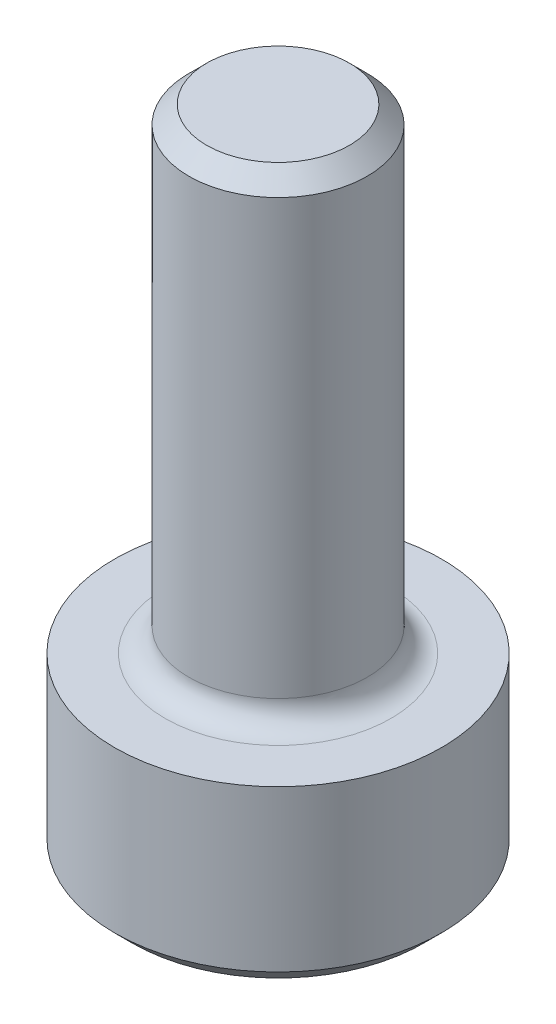
ISO-10303-21;
HEADER;
FILE_DESCRIPTION(('STEP AP214'),'2;1');
FILE_NAME('part.step','',(''),(''),'','','');
FILE_SCHEMA(('AUTOMOTIVE_DESIGN { 1 0 10303 214 1 1 1 1 }'));
ENDSEC;
DATA;
#1=APPLICATION_CONTEXT('core data for automotive mechanical design processes');
#2=APPLICATION_PROTOCOL_DEFINITION('international standard','automotive_design',2000,#1);
#3=PRODUCT_CONTEXT('',#1,'mechanical');
#4=PRODUCT('Part','Part','',(#3));
#5=PRODUCT_RELATED_PRODUCT_CATEGORY('part','',(#4));
#6=PRODUCT_DEFINITION_FORMATION('','',#4);
#7=PRODUCT_DEFINITION_CONTEXT('part definition',#1,'design');
#8=PRODUCT_DEFINITION('design','',#6,#7);
#9=PRODUCT_DEFINITION_SHAPE('','',#8);
#10=(LENGTH_UNIT() NAMED_UNIT(*) SI_UNIT(.MILLI.,.METRE.));
#11=(NAMED_UNIT(*) PLANE_ANGLE_UNIT() SI_UNIT($,.RADIAN.));
#12=(NAMED_UNIT(*) SI_UNIT($,.STERADIAN.) SOLID_ANGLE_UNIT());
#13=UNCERTAINTY_MEASURE_WITH_UNIT(LENGTH_MEASURE(1.E-05),#10,'distance_accuracy_value','');
#14=(GEOMETRIC_REPRESENTATION_CONTEXT(3) GLOBAL_UNCERTAINTY_ASSIGNED_CONTEXT((#13)) GLOBAL_UNIT_ASSIGNED_CONTEXT((#10,
#11,#12)) REPRESENTATION_CONTEXT('',''));
#15=CARTESIAN_POINT('',(0.,0.,0.));
#16=DIRECTION('',(0.,0.,1.));
#17=DIRECTION('',(1.,0.,0.));
#18=AXIS2_PLACEMENT_3D('',#15,#16,#17);
#19=CARTESIAN_POINT('',(0.,8.,0.));
#20=DIRECTION('',(0.,-1.,0.));
#21=DIRECTION('',(0.,0.,-1.));
#22=AXIS2_PLACEMENT_3D('',#19,#20,#21);
#23=CYLINDRICAL_SURFACE('',#22,1.5);
#24=CARTESIAN_POINT('',(0.,7.7,0.));
#25=DIRECTION('',(0.,1.,0.));
#26=DIRECTION('',(0.,0.,1.));
#27=AXIS2_PLACEMENT_3D('',#24,#25,#26);
#28=CIRCLE('',#27,1.5);
#29=CARTESIAN_POINT('',(0.,7.7,1.5));
#30=VERTEX_POINT('',#29);
#31=EDGE_CURVE('E11',#30,#30,#28,.F.);
#32=ORIENTED_EDGE('',*,*,#31,.T.);
#33=EDGE_LOOP('',(#32));
#34=FACE_BOUND('',#33,.T.);
#35=CARTESIAN_POINT('',(0.,0.4,0.));
#36=DIRECTION('',(0.,1.,0.));
#37=DIRECTION('',(0.,0.,1.));
#38=AXIS2_PLACEMENT_3D('',#35,#36,#37);
#39=CIRCLE('',#38,1.5);
#40=CARTESIAN_POINT('',(0.,0.4,1.5));
#41=VERTEX_POINT('',#40);
#42=EDGE_CURVE('E143',#41,#41,#39,.T.);
#43=ORIENTED_EDGE('',*,*,#42,.T.);
#44=EDGE_LOOP('',(#43));
#45=FACE_BOUND('',#44,.T.);
#46=ADVANCED_FACE('F33',(#34,#45),#23,.T.);
#47=CARTESIAN_POINT('',(0.,8.,0.));
#48=DIRECTION('',(0.,1.,0.));
#49=DIRECTION('',(0.,0.,1.));
#50=AXIS2_PLACEMENT_3D('',#47,#48,#49);
#51=PLANE('',#50);
#52=CARTESIAN_POINT('',(0.,8.,0.));
#53=DIRECTION('',(0.,1.,0.));
#54=DIRECTION('',(0.,0.,1.));
#55=AXIS2_PLACEMENT_3D('',#52,#53,#54);
#56=CIRCLE('',#55,1.2);
#57=CARTESIAN_POINT('',(0.,8.,1.2));
#58=VERTEX_POINT('',#57);
#59=EDGE_CURVE('E41',#58,#58,#56,.T.);
#60=ORIENTED_EDGE('',*,*,#59,.T.);
#61=EDGE_LOOP('',(#60));
#62=FACE_BOUND('',#61,.T.);
#63=ADVANCED_FACE('F157',(#62),#51,.T.);
#64=CARTESIAN_POINT('',(0.,-3.,0.));
#65=DIRECTION('',(0.,1.,0.));
#66=DIRECTION('',(0.,0.,1.));
#67=AXIS2_PLACEMENT_3D('',#64,#65,#66);
#68=CYLINDRICAL_SURFACE('',#67,2.75);
#69=CARTESIAN_POINT('',(0.,-2.7,0.));
#70=DIRECTION('',(0.,1.,0.));
#71=DIRECTION('',(0.,0.,1.));
#72=AXIS2_PLACEMENT_3D('',#69,#70,#71);
#73=CIRCLE('',#72,2.75);
#74=CARTESIAN_POINT('',(0.,-2.7,2.75));
#75=VERTEX_POINT('',#74);
#76=EDGE_CURVE('E149',#75,#75,#73,.T.);
#77=ORIENTED_EDGE('',*,*,#76,.T.);
#78=EDGE_LOOP('',(#77));
#79=FACE_BOUND('',#78,.T.);
#80=CARTESIAN_POINT('',(0.,0.,0.));
#81=DIRECTION('',(0.,1.,0.));
#82=DIRECTION('',(0.,0.,1.));
#83=AXIS2_PLACEMENT_3D('',#80,#81,#82);
#84=CIRCLE('',#83,2.75);
#85=CARTESIAN_POINT('',(0.,0.,2.75));
#86=VERTEX_POINT('',#85);
#87=EDGE_CURVE('E135',#86,#86,#84,.T.);
#88=ORIENTED_EDGE('',*,*,#87,.F.);
#89=EDGE_LOOP('',(#88));
#90=FACE_BOUND('',#89,.T.);
#91=ADVANCED_FACE('F178',(#79,#90),#68,.T.);
#92=CARTESIAN_POINT('',(0.,-3.,0.));
#93=DIRECTION('',(0.,1.,0.));
#94=DIRECTION('',(0.,0.,1.));
#95=AXIS2_PLACEMENT_3D('',#92,#93,#94);
#96=PLANE('',#95);
#97=DIRECTION('',(-0.866025403784439,0.,-0.5));
#98=VECTOR('',#97,1.);
#99=CARTESIAN_POINT('',(0.,-3.,1.44337567297406));
#100=LINE('',#99,#98);
#101=CARTESIAN_POINT('',(0.,-3.,1.44337567297406));
#102=VERTEX_POINT('',#101);
#103=CARTESIAN_POINT('',(-1.25,-3.,0.721687836487032));
#104=VERTEX_POINT('',#103);
#105=EDGE_CURVE('E122',#102,#104,#100,.T.);
#106=ORIENTED_EDGE('',*,*,#105,.F.);
#107=DIRECTION('',(-0.866025403784439,0.,0.5));
#108=VECTOR('',#107,1.);
#109=CARTESIAN_POINT('',(1.25,-3.,0.721687836487033));
#110=LINE('',#109,#108);
#111=CARTESIAN_POINT('',(1.25,-3.,0.721687836487033));
#112=VERTEX_POINT('',#111);
#113=EDGE_CURVE('E48',#112,#102,#110,.T.);
#114=ORIENTED_EDGE('',*,*,#113,.F.);
#115=DIRECTION('',(0.,0.,1.));
#116=VECTOR('',#115,1.);
#117=CARTESIAN_POINT('',(1.25,-3.,-0.721687836487033));
#118=LINE('',#117,#116);
#119=CARTESIAN_POINT('',(1.25,-3.,-0.721687836487033));
#120=VERTEX_POINT('',#119);
#121=EDGE_CURVE('E131',#120,#112,#118,.T.);
#122=ORIENTED_EDGE('',*,*,#121,.F.);
#123=DIRECTION('',(0.866025403784439,0.,0.5));
#124=VECTOR('',#123,1.);
#125=CARTESIAN_POINT('',(0.,-3.,-1.44337567297406));
#126=LINE('',#125,#124);
#127=CARTESIAN_POINT('',(0.,-3.,-1.44337567297406));
#128=VERTEX_POINT('',#127);
#129=EDGE_CURVE('E129',#128,#120,#126,.T.);
#130=ORIENTED_EDGE('',*,*,#129,.F.);
#131=DIRECTION('',(0.866025403784439,0.,-0.5));
#132=VECTOR('',#131,1.);
#133=CARTESIAN_POINT('',(-1.25,-3.,-0.721687836487033));
#134=LINE('',#133,#132);
#135=CARTESIAN_POINT('',(-1.25,-3.,-0.721687836487033));
#136=VERTEX_POINT('',#135);
#137=EDGE_CURVE('E96',#136,#128,#134,.T.);
#138=ORIENTED_EDGE('',*,*,#137,.F.);
#139=DIRECTION('',(0.,0.,-1.));
#140=VECTOR('',#139,1.);
#141=CARTESIAN_POINT('',(-1.25,-3.,0.721687836487032));
#142=LINE('',#141,#140);
#143=EDGE_CURVE('E125',#104,#136,#142,.T.);
#144=ORIENTED_EDGE('',*,*,#143,.F.);
#145=EDGE_LOOP('',(#106,#114,#122,#130,#138,#144));
#146=FACE_BOUND('',#145,.T.);
#147=CARTESIAN_POINT('',(0.,-3.,0.));
#148=DIRECTION('',(0.,1.,0.));
#149=DIRECTION('',(0.,0.,1.));
#150=AXIS2_PLACEMENT_3D('',#147,#148,#149);
#151=CIRCLE('',#150,2.45);
#152=CARTESIAN_POINT('',(0.,-3.,2.45));
#153=VERTEX_POINT('',#152);
#154=EDGE_CURVE('E152',#153,#153,#151,.F.);
#155=ORIENTED_EDGE('',*,*,#154,.T.);
#156=EDGE_LOOP('',(#155));
#157=FACE_BOUND('',#156,.T.);
#158=ADVANCED_FACE('F189',(#146,#157),#96,.F.);
#159=CARTESIAN_POINT('',(0.,0.,0.));
#160=DIRECTION('',(0.,1.,0.));
#161=DIRECTION('',(0.,0.,1.));
#162=AXIS2_PLACEMENT_3D('',#159,#160,#161);
#163=PLANE('',#162);
#164=CARTESIAN_POINT('',(0.,0.,0.));
#165=DIRECTION('',(0.,1.,0.));
#166=DIRECTION('',(0.,0.,1.));
#167=AXIS2_PLACEMENT_3D('',#164,#165,#166);
#168=CIRCLE('',#167,1.9);
#169=CARTESIAN_POINT('',(0.,0.,1.9));
#170=VERTEX_POINT('',#169);
#171=EDGE_CURVE('E146',#170,#170,#168,.F.);
#172=ORIENTED_EDGE('',*,*,#171,.T.);
#173=EDGE_LOOP('',(#172));
#174=FACE_BOUND('',#173,.T.);
#175=ORIENTED_EDGE('',*,*,#87,.T.);
#176=EDGE_LOOP('',(#175));
#177=FACE_BOUND('',#176,.T.);
#178=ADVANCED_FACE('F184',(#174,#177),#163,.T.);
#179=CARTESIAN_POINT('',(0.,0.4,0.));
#180=DIRECTION('',(0.,1.,0.));
#181=DIRECTION('',(0.,0.,1.));
#182=AXIS2_PLACEMENT_3D('',#179,#180,#181);
#183=TOROIDAL_SURFACE('',#182,1.9,0.4);
#184=ORIENTED_EDGE('',*,*,#171,.F.);
#185=EDGE_LOOP('',(#184));
#186=FACE_BOUND('',#185,.T.);
#187=ORIENTED_EDGE('',*,*,#42,.F.);
#188=EDGE_LOOP('',(#187));
#189=FACE_BOUND('',#188,.T.);
#190=ADVANCED_FACE('F169',(#186,#189),#183,.F.);
#191=CARTESIAN_POINT('',(0.,-2.7,0.));
#192=DIRECTION('',(0.,1.,0.));
#193=DIRECTION('',(0.,0.,1.));
#194=AXIS2_PLACEMENT_3D('',#191,#192,#193);
#195=CONICAL_SURFACE('',#194,2.75,0.78539816339745);
#196=ORIENTED_EDGE('',*,*,#154,.F.);
#197=EDGE_LOOP('',(#196));
#198=FACE_BOUND('',#197,.T.);
#199=ORIENTED_EDGE('',*,*,#76,.F.);
#200=EDGE_LOOP('',(#199));
#201=FACE_BOUND('',#200,.T.);
#202=ADVANCED_FACE('F161',(#198,#201),#195,.T.);
#203=CARTESIAN_POINT('',(0.,8.,0.));
#204=DIRECTION('',(0.,-1.,0.));
#205=DIRECTION('',(0.,0.,-1.));
#206=AXIS2_PLACEMENT_3D('',#203,#204,#205);
#207=CONICAL_SURFACE('',#206,1.2,0.785398163397444);
#208=ORIENTED_EDGE('',*,*,#31,.F.);
#209=EDGE_LOOP('',(#208));
#210=FACE_BOUND('',#209,.T.);
#211=ORIENTED_EDGE('',*,*,#59,.F.);
#212=EDGE_LOOP('',(#211));
#213=FACE_BOUND('',#212,.T.);
#214=ADVANCED_FACE('F35',(#210,#213),#207,.T.);
#215=CARTESIAN_POINT('',(1.25,-0.5,0.721687836487033));
#216=DIRECTION('',(0.5,0.,0.866025403784439));
#217=DIRECTION('',(0.866025403784439,0.,-0.5));
#218=AXIS2_PLACEMENT_3D('',#215,#216,#217);
#219=PLANE('',#218);
#220=ORIENTED_EDGE('',*,*,#113,.T.);
#221=DIRECTION('',(0.,-1.,0.));
#222=VECTOR('',#221,1.);
#223=CARTESIAN_POINT('',(0.,-0.5,1.44337567297406));
#224=LINE('',#223,#222);
#225=CARTESIAN_POINT('',(0.,-0.5,1.44337567297406));
#226=VERTEX_POINT('',#225);
#227=EDGE_CURVE('E78',#226,#102,#224,.T.);
#228=ORIENTED_EDGE('',*,*,#227,.F.);
#229=DIRECTION('',(-0.866025403784439,0.,0.5));
#230=VECTOR('',#229,1.);
#231=CARTESIAN_POINT('',(1.25,-0.5,0.721687836487033));
#232=LINE('',#231,#230);
#233=CARTESIAN_POINT('',(1.25,-0.5,0.721687836487033));
#234=VERTEX_POINT('',#233);
#235=EDGE_CURVE('E133',#234,#226,#232,.T.);
#236=ORIENTED_EDGE('',*,*,#235,.F.);
#237=DIRECTION('',(0.,-1.,0.));
#238=VECTOR('',#237,1.);
#239=CARTESIAN_POINT('',(1.25,-0.5,0.721687836487033));
#240=LINE('',#239,#238);
#241=EDGE_CURVE('E56',#234,#112,#240,.T.);
#242=ORIENTED_EDGE('',*,*,#241,.T.);
#243=EDGE_LOOP('',(#220,#228,#236,#242));
#244=FACE_BOUND('',#243,.T.);
#245=ADVANCED_FACE('F160',(#244),#219,.F.);
#246=CARTESIAN_POINT('',(1.25,-0.5,-0.721687836487033));
#247=DIRECTION('',(1.,0.,0.));
#248=DIRECTION('',(0.,0.,-1.));
#249=AXIS2_PLACEMENT_3D('',#246,#247,#248);
#250=PLANE('',#249);
#251=ORIENTED_EDGE('',*,*,#121,.T.);
#252=ORIENTED_EDGE('',*,*,#241,.F.);
#253=DIRECTION('',(0.,0.,1.));
#254=VECTOR('',#253,1.);
#255=CARTESIAN_POINT('',(1.25,-0.5,-0.721687836487033));
#256=LINE('',#255,#254);
#257=CARTESIAN_POINT('',(1.25,-0.5,-0.721687836487033));
#258=VERTEX_POINT('',#257);
#259=EDGE_CURVE('E108',#258,#234,#256,.T.);
#260=ORIENTED_EDGE('',*,*,#259,.F.);
#261=DIRECTION('',(0.,-1.,0.));
#262=VECTOR('',#261,1.);
#263=CARTESIAN_POINT('',(1.25,-0.5,-0.721687836487033));
#264=LINE('',#263,#262);
#265=EDGE_CURVE('E100',#258,#120,#264,.T.);
#266=ORIENTED_EDGE('',*,*,#265,.T.);
#267=EDGE_LOOP('',(#251,#252,#260,#266));
#268=FACE_BOUND('',#267,.T.);
#269=ADVANCED_FACE('F167',(#268),#250,.F.);
#270=CARTESIAN_POINT('',(0.,-0.5,-1.44337567297406));
#271=DIRECTION('',(0.5,0.,-0.866025403784439));
#272=DIRECTION('',(-0.866025403784439,0.,-0.5));
#273=AXIS2_PLACEMENT_3D('',#270,#271,#272);
#274=PLANE('',#273);
#275=ORIENTED_EDGE('',*,*,#129,.T.);
#276=ORIENTED_EDGE('',*,*,#265,.F.);
#277=DIRECTION('',(0.866025403784439,0.,0.5));
#278=VECTOR('',#277,1.);
#279=CARTESIAN_POINT('',(0.,-0.5,-1.44337567297406));
#280=LINE('',#279,#278);
#281=CARTESIAN_POINT('',(0.,-0.5,-1.44337567297406));
#282=VERTEX_POINT('',#281);
#283=EDGE_CURVE('E104',#282,#258,#280,.T.);
#284=ORIENTED_EDGE('',*,*,#283,.F.);
#285=DIRECTION('',(0.,-1.,0.));
#286=VECTOR('',#285,1.);
#287=CARTESIAN_POINT('',(0.,-0.5,-1.44337567297406));
#288=LINE('',#287,#286);
#289=EDGE_CURVE('E89',#282,#128,#288,.T.);
#290=ORIENTED_EDGE('',*,*,#289,.T.);
#291=EDGE_LOOP('',(#275,#276,#284,#290));
#292=FACE_BOUND('',#291,.T.);
#293=ADVANCED_FACE('F105',(#292),#274,.F.);
#294=CARTESIAN_POINT('',(-1.25,-0.5,-0.721687836487033));
#295=DIRECTION('',(-0.5,0.,-0.866025403784439));
#296=DIRECTION('',(-0.866025403784439,0.,0.5));
#297=AXIS2_PLACEMENT_3D('',#294,#295,#296);
#298=PLANE('',#297);
#299=ORIENTED_EDGE('',*,*,#137,.T.);
#300=ORIENTED_EDGE('',*,*,#289,.F.);
#301=DIRECTION('',(0.866025403784439,0.,-0.5));
#302=VECTOR('',#301,1.);
#303=CARTESIAN_POINT('',(-1.25,-0.5,-0.721687836487033));
#304=LINE('',#303,#302);
#305=CARTESIAN_POINT('',(-1.25,-0.5,-0.721687836487033));
#306=VERTEX_POINT('',#305);
#307=EDGE_CURVE('E93',#306,#282,#304,.T.);
#308=ORIENTED_EDGE('',*,*,#307,.F.);
#309=DIRECTION('',(0.,-1.,0.));
#310=VECTOR('',#309,1.);
#311=CARTESIAN_POINT('',(-1.25,-0.5,-0.721687836487033));
#312=LINE('',#311,#310);
#313=EDGE_CURVE('E101',#306,#136,#312,.T.);
#314=ORIENTED_EDGE('',*,*,#313,.T.);
#315=EDGE_LOOP('',(#299,#300,#308,#314));
#316=FACE_BOUND('',#315,.T.);
#317=ADVANCED_FACE('F91',(#316),#298,.F.);
#318=CARTESIAN_POINT('',(-1.25,-0.5,0.721687836487032));
#319=DIRECTION('',(-1.,0.,0.));
#320=DIRECTION('',(0.,0.,1.));
#321=AXIS2_PLACEMENT_3D('',#318,#319,#320);
#322=PLANE('',#321);
#323=ORIENTED_EDGE('',*,*,#143,.T.);
#324=ORIENTED_EDGE('',*,*,#313,.F.);
#325=DIRECTION('',(0.,0.,-1.));
#326=VECTOR('',#325,1.);
#327=CARTESIAN_POINT('',(-1.25,-0.5,0.721687836487032));
#328=LINE('',#327,#326);
#329=CARTESIAN_POINT('',(-1.25,-0.5,0.721687836487032));
#330=VERTEX_POINT('',#329);
#331=EDGE_CURVE('E114',#330,#306,#328,.T.);
#332=ORIENTED_EDGE('',*,*,#331,.F.);
#333=DIRECTION('',(0.,-1.,0.));
#334=VECTOR('',#333,1.);
#335=CARTESIAN_POINT('',(-1.25,-0.5,0.721687836487032));
#336=LINE('',#335,#334);
#337=EDGE_CURVE('E138',#330,#104,#336,.T.);
#338=ORIENTED_EDGE('',*,*,#337,.T.);
#339=EDGE_LOOP('',(#323,#324,#332,#338));
#340=FACE_BOUND('',#339,.T.);
#341=ADVANCED_FACE('F209',(#340),#322,.F.);
#342=CARTESIAN_POINT('',(0.,-0.5,1.44337567297406));
#343=DIRECTION('',(-0.5,0.,0.866025403784439));
#344=DIRECTION('',(0.866025403784439,0.,0.5));
#345=AXIS2_PLACEMENT_3D('',#342,#343,#344);
#346=PLANE('',#345);
#347=ORIENTED_EDGE('',*,*,#105,.T.);
#348=ORIENTED_EDGE('',*,*,#337,.F.);
#349=DIRECTION('',(-0.866025403784439,0.,-0.5));
#350=VECTOR('',#349,1.);
#351=CARTESIAN_POINT('',(0.,-0.5,1.44337567297406));
#352=LINE('',#351,#350);
#353=EDGE_CURVE('E116',#226,#330,#352,.T.);
#354=ORIENTED_EDGE('',*,*,#353,.F.);
#355=ORIENTED_EDGE('',*,*,#227,.T.);
#356=EDGE_LOOP('',(#347,#348,#354,#355));
#357=FACE_BOUND('',#356,.T.);
#358=ADVANCED_FACE('F206',(#357),#346,.F.);
#359=CARTESIAN_POINT('',(0.,-0.5,0.));
#360=DIRECTION('',(0.,-1.,0.));
#361=DIRECTION('',(0.,0.,-1.));
#362=AXIS2_PLACEMENT_3D('',#359,#360,#361);
#363=PLANE('',#362);
#364=ORIENTED_EDGE('',*,*,#235,.T.);
#365=ORIENTED_EDGE('',*,*,#353,.T.);
#366=ORIENTED_EDGE('',*,*,#331,.T.);
#367=ORIENTED_EDGE('',*,*,#307,.T.);
#368=ORIENTED_EDGE('',*,*,#283,.T.);
#369=ORIENTED_EDGE('',*,*,#259,.T.);
#370=EDGE_LOOP('',(#364,#365,#366,#367,#368,#369));
#371=FACE_BOUND('',#370,.T.);
#372=ADVANCED_FACE('F111',(#371),#363,.T.);
#373=CLOSED_SHELL('',(#46,#63,#91,#158,#178,#190,#202,#214,#245,#269,#293,#317,#341,#358,#372));
#374=MANIFOLD_SOLID_BREP('B2',#373);
#375=ADVANCED_BREP_SHAPE_REPRESENTATION('',(#18,#374),#14);
#376=SHAPE_DEFINITION_REPRESENTATION(#9,#375);
ENDSEC;
END-ISO-10303-21;
